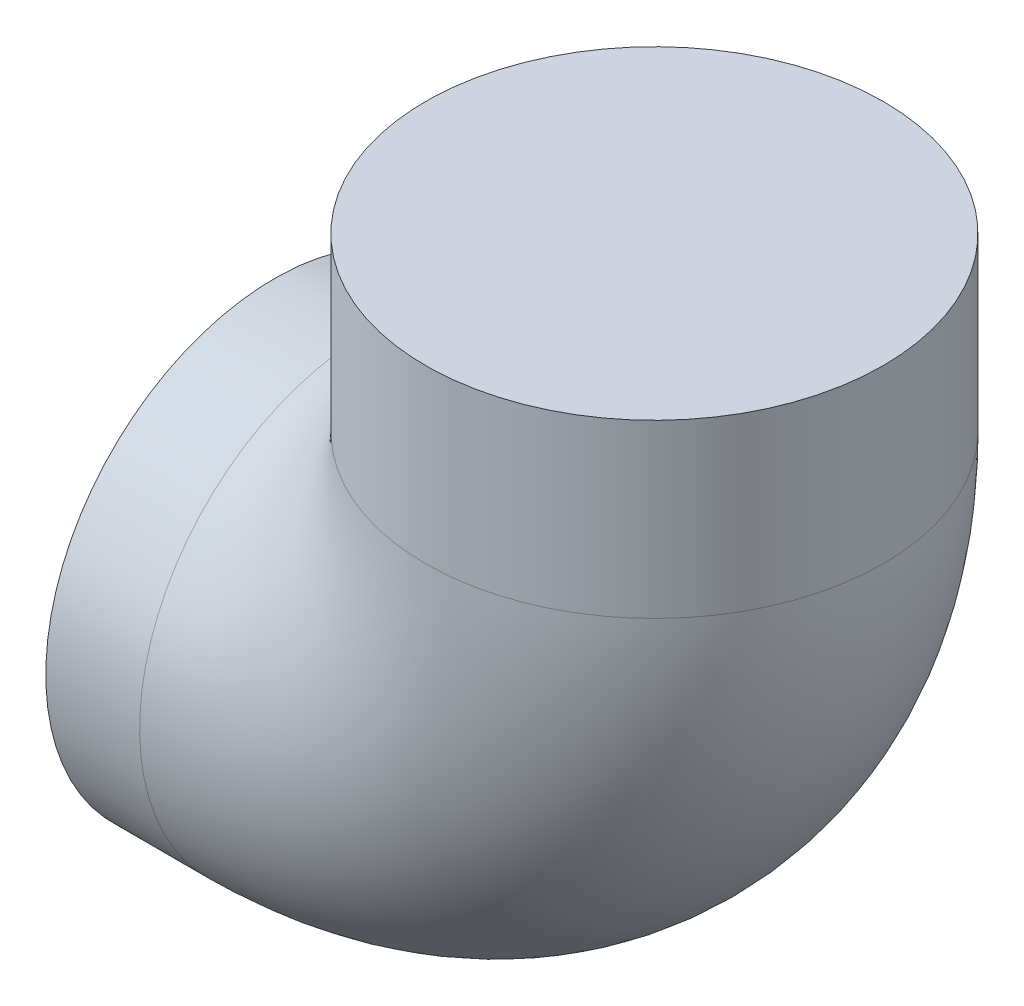
ISO-10303-21;
HEADER;
FILE_DESCRIPTION(('STEP AP214'),'2;1');
FILE_NAME('part.step','',(''),(''),'','','');
FILE_SCHEMA(('AUTOMOTIVE_DESIGN { 1 0 10303 214 1 1 1 1 }'));
ENDSEC;
DATA;
#1=APPLICATION_CONTEXT('core data for automotive mechanical design processes');
#2=APPLICATION_PROTOCOL_DEFINITION('international standard','automotive_design',2000,#1);
#3=PRODUCT_CONTEXT('',#1,'mechanical');
#4=PRODUCT('Part','Part','',(#3));
#5=PRODUCT_RELATED_PRODUCT_CATEGORY('part','',(#4));
#6=PRODUCT_DEFINITION_FORMATION('','',#4);
#7=PRODUCT_DEFINITION_CONTEXT('part definition',#1,'design');
#8=PRODUCT_DEFINITION('design','',#6,#7);
#9=PRODUCT_DEFINITION_SHAPE('','',#8);
#10=(LENGTH_UNIT() NAMED_UNIT(*) SI_UNIT(.MILLI.,.METRE.));
#11=(NAMED_UNIT(*) PLANE_ANGLE_UNIT() SI_UNIT($,.RADIAN.));
#12=(NAMED_UNIT(*) SI_UNIT($,.STERADIAN.) SOLID_ANGLE_UNIT());
#13=UNCERTAINTY_MEASURE_WITH_UNIT(LENGTH_MEASURE(1.E-05),#10,'distance_accuracy_value','');
#14=(GEOMETRIC_REPRESENTATION_CONTEXT(3) GLOBAL_UNCERTAINTY_ASSIGNED_CONTEXT((#13)) GLOBAL_UNIT_ASSIGNED_CONTEXT((#10,
#11,#12)) REPRESENTATION_CONTEXT('',''));
#15=CARTESIAN_POINT('',(0.,0.,0.));
#16=DIRECTION('',(0.,0.,1.));
#17=DIRECTION('',(1.,0.,0.));
#18=AXIS2_PLACEMENT_3D('',#15,#16,#17);
#19=CARTESIAN_POINT('',(0.,0.,0.));
#20=DIRECTION('',(1.,0.,0.));
#21=DIRECTION('',(0.,0.,-1.));
#22=AXIS2_PLACEMENT_3D('',#19,#20,#21);
#23=PLANE('',#22);
#24=CARTESIAN_POINT('',(0.,0.,0.));
#25=DIRECTION('',(1.,0.,0.));
#26=DIRECTION('',(0.,0.,-1.));
#27=AXIS2_PLACEMENT_3D('',#24,#25,#26);
#28=CIRCLE('',#27,20.);
#29=CARTESIAN_POINT('',(0.,0.,-20.));
#30=VERTEX_POINT('',#29);
#31=EDGE_CURVE('E47',#30,#30,#28,.T.);
#32=ORIENTED_EDGE('',*,*,#31,.F.);
#33=EDGE_LOOP('',(#32));
#34=FACE_BOUND('',#33,.T.);
#35=ADVANCED_FACE('F33',(#34),#23,.F.);
#36=CARTESIAN_POINT('',(33.2,40.,0.));
#37=DIRECTION('',(0.,1.,0.));
#38=DIRECTION('',(0.,0.,-1.));
#39=AXIS2_PLACEMENT_3D('',#36,#37,#38);
#40=PLANE('',#39);
#41=CARTESIAN_POINT('',(33.2,40.,0.));
#42=DIRECTION('',(0.,1.,0.));
#43=DIRECTION('',(0.,0.,-1.));
#44=AXIS2_PLACEMENT_3D('',#41,#42,#43);
#45=CIRCLE('',#44,20.);
#46=CARTESIAN_POINT('',(33.2,40.,-20.));
#47=VERTEX_POINT('',#46);
#48=EDGE_CURVE('E10',#47,#47,#45,.T.);
#49=ORIENTED_EDGE('',*,*,#48,.T.);
#50=EDGE_LOOP('',(#49));
#51=FACE_BOUND('',#50,.T.);
#52=ADVANCED_FACE('F56',(#51),#40,.T.);
#53=CARTESIAN_POINT('',(0.,0.,0.));
#54=DIRECTION('',(1.,0.,0.));
#55=DIRECTION('',(0.,0.,-1.));
#56=AXIS2_PLACEMENT_3D('',#53,#54,#55);
#57=CYLINDRICAL_SURFACE('',#56,20.);
#58=CARTESIAN_POINT('',(8.19999999999983,0.,0.));
#59=DIRECTION('',(1.,0.,0.));
#60=DIRECTION('',(0.,0.,-1.));
#61=AXIS2_PLACEMENT_3D('',#58,#59,#60);
#62=CIRCLE('',#61,20.);
#63=CARTESIAN_POINT('',(8.19999999999968,-20.,0.));
#64=VERTEX_POINT('',#63);
#65=EDGE_CURVE('E43',#64,#64,#62,.T.);
#66=ORIENTED_EDGE('',*,*,#65,.F.);
#67=EDGE_LOOP('',(#66));
#68=FACE_BOUND('',#67,.T.);
#69=ORIENTED_EDGE('',*,*,#31,.T.);
#70=EDGE_LOOP('',(#69));
#71=FACE_BOUND('',#70,.T.);
#72=ADVANCED_FACE('F53',(#68,#71),#57,.T.);
#73=CARTESIAN_POINT('',(8.2,25.,0.));
#74=DIRECTION('',(0.,0.,1.));
#75=DIRECTION('',(1.,0.,0.));
#76=AXIS2_PLACEMENT_3D('',#73,#74,#75);
#77=TOROIDAL_SURFACE('',#76,25.,20.);
#78=CARTESIAN_POINT('',(33.2,25.,0.));
#79=DIRECTION('',(0.,1.,0.));
#80=DIRECTION('',(0.,0.,-1.));
#81=AXIS2_PLACEMENT_3D('',#78,#79,#80);
#82=CIRCLE('',#81,20.);
#83=CARTESIAN_POINT('',(53.2,25.,0.));
#84=VERTEX_POINT('',#83);
#85=EDGE_CURVE('E39',#84,#84,#82,.T.);
#86=CARTESIAN_POINT('',(8.2,25.,0.));
#87=DIRECTION('',(0.,0.,1.));
#88=DIRECTION('',(1.,0.,0.));
#89=AXIS2_PLACEMENT_3D('',#86,#87,#88);
#90=CIRCLE('',#89,45.);
#91=EDGE_CURVE('',#64,#84,#90,.T.);
#92=ORIENTED_EDGE('',*,*,#65,.T.);
#93=ORIENTED_EDGE('',*,*,#85,.F.);
#94=ORIENTED_EDGE('',*,*,#91,.T.);
#95=ORIENTED_EDGE('',*,*,#91,.F.);
#96=EDGE_LOOP('',(#92,#94,#93,#95));
#97=FACE_BOUND('',#96,.T.);
#98=ADVANCED_FACE('F62',(#97),#77,.T.);
#99=CARTESIAN_POINT('',(33.2,25.,0.));
#100=DIRECTION('',(0.,1.,0.));
#101=DIRECTION('',(0.,0.,1.));
#102=AXIS2_PLACEMENT_3D('',#99,#100,#101);
#103=CYLINDRICAL_SURFACE('',#102,20.);
#104=ORIENTED_EDGE('',*,*,#48,.F.);
#105=EDGE_LOOP('',(#104));
#106=FACE_BOUND('',#105,.T.);
#107=ORIENTED_EDGE('',*,*,#85,.T.);
#108=EDGE_LOOP('',(#107));
#109=FACE_BOUND('',#108,.T.);
#110=ADVANCED_FACE('F60',(#106,#109),#103,.T.);
#111=CLOSED_SHELL('',(#35,#52,#72,#98,#110));
#112=MANIFOLD_SOLID_BREP('B2',#111);
#113=ADVANCED_BREP_SHAPE_REPRESENTATION('',(#18,#112),#14);
#114=SHAPE_DEFINITION_REPRESENTATION(#9,#113);
ENDSEC;
END-ISO-10303-21;
